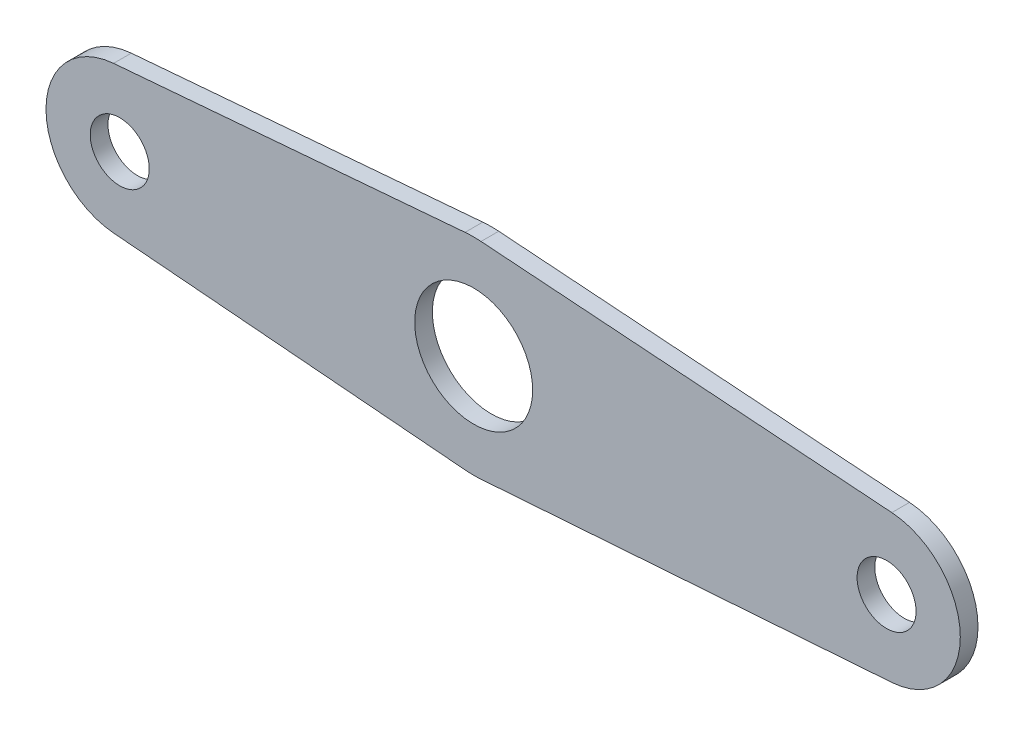
ISO-10303-21;
HEADER;
FILE_DESCRIPTION(('STEP AP214'),'2;1');
FILE_NAME('part.step','',(''),(''),'','','');
FILE_SCHEMA(('AUTOMOTIVE_DESIGN { 1 0 10303 214 1 1 1 1 }'));
ENDSEC;
DATA;
#1=APPLICATION_CONTEXT('core data for automotive mechanical design processes');
#2=APPLICATION_PROTOCOL_DEFINITION('international standard','automotive_design',2000,#1);
#3=PRODUCT_CONTEXT('',#1,'mechanical');
#4=PRODUCT('Part','Part','',(#3));
#5=PRODUCT_RELATED_PRODUCT_CATEGORY('part','',(#4));
#6=PRODUCT_DEFINITION_FORMATION('','',#4);
#7=PRODUCT_DEFINITION_CONTEXT('part definition',#1,'design');
#8=PRODUCT_DEFINITION('design','',#6,#7);
#9=PRODUCT_DEFINITION_SHAPE('','',#8);
#10=(LENGTH_UNIT() NAMED_UNIT(*) SI_UNIT(.MILLI.,.METRE.));
#11=(NAMED_UNIT(*) PLANE_ANGLE_UNIT() SI_UNIT($,.RADIAN.));
#12=(NAMED_UNIT(*) SI_UNIT($,.STERADIAN.) SOLID_ANGLE_UNIT());
#13=UNCERTAINTY_MEASURE_WITH_UNIT(LENGTH_MEASURE(1.E-05),#10,'distance_accuracy_value','');
#14=(GEOMETRIC_REPRESENTATION_CONTEXT(3) GLOBAL_UNCERTAINTY_ASSIGNED_CONTEXT((#13)) GLOBAL_UNIT_ASSIGNED_CONTEXT((#10,
#11,#12)) REPRESENTATION_CONTEXT('',''));
#15=CARTESIAN_POINT('',(0.,0.,0.));
#16=DIRECTION('',(0.,0.,1.));
#17=DIRECTION('',(1.,0.,0.));
#18=AXIS2_PLACEMENT_3D('',#15,#16,#17);
#19=CARTESIAN_POINT('',(-60.,0.,3.));
#20=DIRECTION('',(0.,0.,1.));
#21=DIRECTION('',(1.,0.,0.));
#22=AXIS2_PLACEMENT_3D('',#19,#20,#21);
#23=PLANE('',#22);
#24=CARTESIAN_POINT('',(0.,0.,3.));
#25=DIRECTION('',(0.,0.,1.));
#26=DIRECTION('',(1.,0.,0.));
#27=AXIS2_PLACEMENT_3D('',#24,#25,#26);
#28=CIRCLE('',#27,10.);
#29=CARTESIAN_POINT('',(10.,0.,3.));
#30=VERTEX_POINT('',#29);
#31=EDGE_CURVE('E213',#30,#30,#28,.T.);
#32=ORIENTED_EDGE('',*,*,#31,.F.);
#33=EDGE_LOOP('',(#32));
#34=FACE_BOUND('',#33,.T.);
#35=CARTESIAN_POINT('',(-60.,0.,3.));
#36=DIRECTION('',(0.,0.,1.));
#37=DIRECTION('',(1.,0.,0.));
#38=AXIS2_PLACEMENT_3D('',#35,#36,#37);
#39=CIRCLE('',#38,12.5);
#40=CARTESIAN_POINT('',(-61.0416666666667,12.4565216073973,3.));
#41=VERTEX_POINT('',#40);
#42=CARTESIAN_POINT('',(-61.0416666666667,-12.4565216073973,3.));
#43=VERTEX_POINT('',#42);
#44=EDGE_CURVE('E164',#41,#43,#39,.T.);
#45=ORIENTED_EDGE('',*,*,#44,.T.);
#46=DIRECTION('',(0.996521728591783,-0.0833333333333333,0.));
#47=VECTOR('',#46,1.);
#48=CARTESIAN_POINT('',(-61.0416666666667,-12.4565216073973,3.));
#49=LINE('',#48,#47);
#50=CARTESIAN_POINT('',(-1.45833333333334,-17.4391302503562,3.));
#51=VERTEX_POINT('',#50);
#52=EDGE_CURVE('E100',#43,#51,#49,.T.);
#53=ORIENTED_EDGE('',*,*,#52,.T.);
#54=CARTESIAN_POINT('',(0.,0.,3.));
#55=DIRECTION('',(0.,0.,1.));
#56=DIRECTION('',(1.,0.,0.));
#57=AXIS2_PLACEMENT_3D('',#54,#55,#56);
#58=CIRCLE('',#57,17.5);
#59=CARTESIAN_POINT('',(1.25,-17.4553000547112,3.));
#60=VERTEX_POINT('',#59);
#61=EDGE_CURVE('E185',#51,#60,#58,.T.);
#62=ORIENTED_EDGE('',*,*,#61,.T.);
#63=DIRECTION('',(0.997445717412067,0.0714285714285715,0.));
#64=VECTOR('',#63,1.);
#65=CARTESIAN_POINT('',(1.25,-17.4553000547112,3.));
#66=LINE('',#65,#64);
#67=CARTESIAN_POINT('',(70.8928571428572,-12.4680714676508,3.));
#68=VERTEX_POINT('',#67);
#69=EDGE_CURVE('E199',#60,#68,#66,.T.);
#70=ORIENTED_EDGE('',*,*,#69,.T.);
#71=CARTESIAN_POINT('',(70.,0.,3.));
#72=DIRECTION('',(0.,0.,1.));
#73=DIRECTION('',(1.,0.,0.));
#74=AXIS2_PLACEMENT_3D('',#71,#72,#73);
#75=CIRCLE('',#74,12.5);
#76=CARTESIAN_POINT('',(70.8928571428572,12.4680714676508,3.));
#77=VERTEX_POINT('',#76);
#78=EDGE_CURVE('E119',#68,#77,#75,.T.);
#79=ORIENTED_EDGE('',*,*,#78,.T.);
#80=DIRECTION('',(-0.997445717412067,0.0714285714285714,0.));
#81=VECTOR('',#80,1.);
#82=CARTESIAN_POINT('',(1.25,17.4553000547112,3.));
#83=LINE('',#82,#81);
#84=CARTESIAN_POINT('',(1.25,17.4553000547112,3.));
#85=VERTEX_POINT('',#84);
#86=EDGE_CURVE('E113',#77,#85,#83,.T.);
#87=ORIENTED_EDGE('',*,*,#86,.T.);
#88=CARTESIAN_POINT('',(0.,0.,3.));
#89=DIRECTION('',(0.,0.,1.));
#90=DIRECTION('',(1.,0.,0.));
#91=AXIS2_PLACEMENT_3D('',#88,#89,#90);
#92=CIRCLE('',#91,17.5);
#93=CARTESIAN_POINT('',(-1.45833333333333,17.4391302503562,3.));
#94=VERTEX_POINT('',#93);
#95=EDGE_CURVE('E117',#85,#94,#92,.T.);
#96=ORIENTED_EDGE('',*,*,#95,.T.);
#97=DIRECTION('',(-0.996521728591783,-0.0833333333333334,0.));
#98=VECTOR('',#97,1.);
#99=CARTESIAN_POINT('',(-61.0416666666667,12.4565216073973,3.));
#100=LINE('',#99,#98);
#101=EDGE_CURVE('E57',#94,#41,#100,.T.);
#102=ORIENTED_EDGE('',*,*,#101,.T.);
#103=EDGE_LOOP('',(#45,#53,#62,#70,#79,#87,#96,#102));
#104=FACE_BOUND('',#103,.T.);
#105=CARTESIAN_POINT('',(-60.,0.,3.));
#106=DIRECTION('',(0.,0.,1.));
#107=DIRECTION('',(1.,0.,0.));
#108=AXIS2_PLACEMENT_3D('',#105,#106,#107);
#109=CIRCLE('',#108,5.);
#110=CARTESIAN_POINT('',(-55.,0.,3.));
#111=VERTEX_POINT('',#110);
#112=EDGE_CURVE('E146',#111,#111,#109,.T.);
#113=ORIENTED_EDGE('',*,*,#112,.F.);
#114=EDGE_LOOP('',(#113));
#115=FACE_BOUND('',#114,.T.);
#116=CARTESIAN_POINT('',(70.,0.,3.));
#117=DIRECTION('',(0.,0.,1.));
#118=DIRECTION('',(1.,0.,0.));
#119=AXIS2_PLACEMENT_3D('',#116,#117,#118);
#120=CIRCLE('',#119,5.);
#121=CARTESIAN_POINT('',(75.,0.,3.));
#122=VERTEX_POINT('',#121);
#123=EDGE_CURVE('E221',#122,#122,#120,.T.);
#124=ORIENTED_EDGE('',*,*,#123,.F.);
#125=EDGE_LOOP('',(#124));
#126=FACE_BOUND('',#125,.T.);
#127=ADVANCED_FACE('F39',(#34,#104,#115,#126),#23,.T.);
#128=CARTESIAN_POINT('',(-60.,0.,0.));
#129=DIRECTION('',(0.,0.,1.));
#130=DIRECTION('',(1.,0.,0.));
#131=AXIS2_PLACEMENT_3D('',#128,#129,#130);
#132=PLANE('',#131);
#133=CARTESIAN_POINT('',(-60.,0.,0.));
#134=DIRECTION('',(0.,0.,1.));
#135=DIRECTION('',(1.,0.,0.));
#136=AXIS2_PLACEMENT_3D('',#133,#134,#135);
#137=CIRCLE('',#136,12.5);
#138=CARTESIAN_POINT('',(-61.0416666666667,12.4565216073973,0.));
#139=VERTEX_POINT('',#138);
#140=CARTESIAN_POINT('',(-61.0416666666667,-12.4565216073973,0.));
#141=VERTEX_POINT('',#140);
#142=EDGE_CURVE('E141',#139,#141,#137,.T.);
#143=ORIENTED_EDGE('',*,*,#142,.F.);
#144=DIRECTION('',(-0.996521728591783,-0.0833333333333334,0.));
#145=VECTOR('',#144,1.);
#146=CARTESIAN_POINT('',(-61.0416666666667,12.4565216073973,0.));
#147=LINE('',#146,#145);
#148=CARTESIAN_POINT('',(-1.45833333333333,17.4391302503562,0.));
#149=VERTEX_POINT('',#148);
#150=EDGE_CURVE('E92',#149,#139,#147,.T.);
#151=ORIENTED_EDGE('',*,*,#150,.F.);
#152=CARTESIAN_POINT('',(0.,0.,0.));
#153=DIRECTION('',(0.,0.,1.));
#154=DIRECTION('',(1.,0.,0.));
#155=AXIS2_PLACEMENT_3D('',#152,#153,#154);
#156=CIRCLE('',#155,17.5);
#157=CARTESIAN_POINT('',(1.25,17.4553000547112,0.));
#158=VERTEX_POINT('',#157);
#159=EDGE_CURVE('E86',#158,#149,#156,.T.);
#160=ORIENTED_EDGE('',*,*,#159,.F.);
#161=DIRECTION('',(-0.997445717412067,0.0714285714285714,0.));
#162=VECTOR('',#161,1.);
#163=CARTESIAN_POINT('',(1.25,17.4553000547112,0.));
#164=LINE('',#163,#162);
#165=CARTESIAN_POINT('',(70.8928571428572,12.4680714676508,0.));
#166=VERTEX_POINT('',#165);
#167=EDGE_CURVE('E128',#166,#158,#164,.T.);
#168=ORIENTED_EDGE('',*,*,#167,.F.);
#169=CARTESIAN_POINT('',(70.,0.,0.));
#170=DIRECTION('',(0.,0.,1.));
#171=DIRECTION('',(1.,0.,0.));
#172=AXIS2_PLACEMENT_3D('',#169,#170,#171);
#173=CIRCLE('',#172,12.5);
#174=CARTESIAN_POINT('',(70.8928571428572,-12.4680714676508,0.));
#175=VERTEX_POINT('',#174);
#176=EDGE_CURVE('E155',#175,#166,#173,.T.);
#177=ORIENTED_EDGE('',*,*,#176,.F.);
#178=DIRECTION('',(0.997445717412067,0.0714285714285715,0.));
#179=VECTOR('',#178,1.);
#180=CARTESIAN_POINT('',(1.25,-17.4553000547112,0.));
#181=LINE('',#180,#179);
#182=CARTESIAN_POINT('',(1.25,-17.4553000547112,0.));
#183=VERTEX_POINT('',#182);
#184=EDGE_CURVE('E152',#183,#175,#181,.T.);
#185=ORIENTED_EDGE('',*,*,#184,.F.);
#186=CARTESIAN_POINT('',(0.,0.,0.));
#187=DIRECTION('',(0.,0.,1.));
#188=DIRECTION('',(1.,0.,0.));
#189=AXIS2_PLACEMENT_3D('',#186,#187,#188);
#190=CIRCLE('',#189,17.5);
#191=CARTESIAN_POINT('',(-1.45833333333334,-17.4391302503562,0.));
#192=VERTEX_POINT('',#191);
#193=EDGE_CURVE('E149',#192,#183,#190,.T.);
#194=ORIENTED_EDGE('',*,*,#193,.F.);
#195=DIRECTION('',(0.996521728591783,-0.0833333333333333,0.));
#196=VECTOR('',#195,1.);
#197=CARTESIAN_POINT('',(-61.0416666666667,-12.4565216073973,0.));
#198=LINE('',#197,#196);
#199=EDGE_CURVE('E145',#141,#192,#198,.T.);
#200=ORIENTED_EDGE('',*,*,#199,.F.);
#201=EDGE_LOOP('',(#143,#151,#160,#168,#177,#185,#194,#200));
#202=FACE_BOUND('',#201,.T.);
#203=CARTESIAN_POINT('',(-60.,0.,0.));
#204=DIRECTION('',(0.,0.,1.));
#205=DIRECTION('',(1.,0.,0.));
#206=AXIS2_PLACEMENT_3D('',#203,#204,#205);
#207=CIRCLE('',#206,5.);
#208=CARTESIAN_POINT('',(-55.,0.,0.));
#209=VERTEX_POINT('',#208);
#210=EDGE_CURVE('E209',#209,#209,#207,.T.);
#211=ORIENTED_EDGE('',*,*,#210,.T.);
#212=EDGE_LOOP('',(#211));
#213=FACE_BOUND('',#212,.T.);
#214=CARTESIAN_POINT('',(0.,0.,0.));
#215=DIRECTION('',(0.,0.,1.));
#216=DIRECTION('',(1.,0.,0.));
#217=AXIS2_PLACEMENT_3D('',#214,#215,#216);
#218=CIRCLE('',#217,10.);
#219=CARTESIAN_POINT('',(10.,0.,0.));
#220=VERTEX_POINT('',#219);
#221=EDGE_CURVE('E217',#220,#220,#218,.T.);
#222=ORIENTED_EDGE('',*,*,#221,.T.);
#223=EDGE_LOOP('',(#222));
#224=FACE_BOUND('',#223,.T.);
#225=CARTESIAN_POINT('',(70.,0.,0.));
#226=DIRECTION('',(0.,0.,1.));
#227=DIRECTION('',(1.,0.,0.));
#228=AXIS2_PLACEMENT_3D('',#225,#226,#227);
#229=CIRCLE('',#228,5.);
#230=CARTESIAN_POINT('',(75.,0.,0.));
#231=VERTEX_POINT('',#230);
#232=EDGE_CURVE('E225',#231,#231,#229,.T.);
#233=ORIENTED_EDGE('',*,*,#232,.T.);
#234=EDGE_LOOP('',(#233));
#235=FACE_BOUND('',#234,.T.);
#236=ADVANCED_FACE('F189',(#202,#213,#224,#235),#132,.F.);
#237=CARTESIAN_POINT('',(-60.,0.,3.));
#238=DIRECTION('',(0.,0.,-1.));
#239=DIRECTION('',(-1.,0.,0.));
#240=AXIS2_PLACEMENT_3D('',#237,#238,#239);
#241=CYLINDRICAL_SURFACE('',#240,12.5);
#242=ORIENTED_EDGE('',*,*,#142,.T.);
#243=DIRECTION('',(0.,0.,-1.));
#244=VECTOR('',#243,1.);
#245=CARTESIAN_POINT('',(-61.0416666666667,-12.4565216073973,3.));
#246=LINE('',#245,#244);
#247=EDGE_CURVE('E11',#43,#141,#246,.T.);
#248=ORIENTED_EDGE('',*,*,#247,.F.);
#249=ORIENTED_EDGE('',*,*,#44,.F.);
#250=DIRECTION('',(0.,0.,-1.));
#251=VECTOR('',#250,1.);
#252=CARTESIAN_POINT('',(-61.0416666666667,12.4565216073973,3.));
#253=LINE('',#252,#251);
#254=EDGE_CURVE('E137',#41,#139,#253,.T.);
#255=ORIENTED_EDGE('',*,*,#254,.T.);
#256=EDGE_LOOP('',(#242,#248,#249,#255));
#257=FACE_BOUND('',#256,.T.);
#258=ADVANCED_FACE('F41',(#257),#241,.T.);
#259=CARTESIAN_POINT('',(-61.0416666666667,-12.4565216073973,3.));
#260=DIRECTION('',(0.0833333333333333,0.996521728591783,0.));
#261=DIRECTION('',(-0.996521728591783,0.0833333333333333,0.));
#262=AXIS2_PLACEMENT_3D('',#259,#260,#261);
#263=PLANE('',#262);
#264=ORIENTED_EDGE('',*,*,#199,.T.);
#265=DIRECTION('',(0.,0.,-1.));
#266=VECTOR('',#265,1.);
#267=CARTESIAN_POINT('',(-1.45833333333334,-17.4391302503562,3.));
#268=LINE('',#267,#266);
#269=EDGE_CURVE('E49',#51,#192,#268,.T.);
#270=ORIENTED_EDGE('',*,*,#269,.F.);
#271=ORIENTED_EDGE('',*,*,#52,.F.);
#272=ORIENTED_EDGE('',*,*,#247,.T.);
#273=EDGE_LOOP('',(#264,#270,#271,#272));
#274=FACE_BOUND('',#273,.T.);
#275=ADVANCED_FACE('F260',(#274),#263,.F.);
#276=CARTESIAN_POINT('',(0.,0.,3.));
#277=DIRECTION('',(0.,0.,-1.));
#278=DIRECTION('',(-1.,0.,0.));
#279=AXIS2_PLACEMENT_3D('',#276,#277,#278);
#280=CYLINDRICAL_SURFACE('',#279,17.5);
#281=ORIENTED_EDGE('',*,*,#193,.T.);
#282=DIRECTION('',(0.,0.,-1.));
#283=VECTOR('',#282,1.);
#284=CARTESIAN_POINT('',(1.25,-17.4553000547112,3.));
#285=LINE('',#284,#283);
#286=EDGE_CURVE('E175',#60,#183,#285,.T.);
#287=ORIENTED_EDGE('',*,*,#286,.F.);
#288=ORIENTED_EDGE('',*,*,#61,.F.);
#289=ORIENTED_EDGE('',*,*,#269,.T.);
#290=EDGE_LOOP('',(#281,#287,#288,#289));
#291=FACE_BOUND('',#290,.T.);
#292=ADVANCED_FACE('F183',(#291),#280,.T.);
#293=CARTESIAN_POINT('',(1.25,-17.4553000547112,3.));
#294=DIRECTION('',(-0.0714285714285715,0.997445717412067,0.));
#295=DIRECTION('',(-0.997445717412067,-0.0714285714285715,0.));
#296=AXIS2_PLACEMENT_3D('',#293,#294,#295);
#297=PLANE('',#296);
#298=ORIENTED_EDGE('',*,*,#184,.T.);
#299=DIRECTION('',(0.,0.,-1.));
#300=VECTOR('',#299,1.);
#301=CARTESIAN_POINT('',(70.8928571428572,-12.4680714676508,3.));
#302=LINE('',#301,#300);
#303=EDGE_CURVE('E171',#68,#175,#302,.T.);
#304=ORIENTED_EDGE('',*,*,#303,.F.);
#305=ORIENTED_EDGE('',*,*,#69,.F.);
#306=ORIENTED_EDGE('',*,*,#286,.T.);
#307=EDGE_LOOP('',(#298,#304,#305,#306));
#308=FACE_BOUND('',#307,.T.);
#309=ADVANCED_FACE('F194',(#308),#297,.F.);
#310=CARTESIAN_POINT('',(70.,0.,3.));
#311=DIRECTION('',(0.,0.,-1.));
#312=DIRECTION('',(-1.,0.,0.));
#313=AXIS2_PLACEMENT_3D('',#310,#311,#312);
#314=CYLINDRICAL_SURFACE('',#313,12.5);
#315=ORIENTED_EDGE('',*,*,#176,.T.);
#316=DIRECTION('',(0.,0.,-1.));
#317=VECTOR('',#316,1.);
#318=CARTESIAN_POINT('',(70.8928571428572,12.4680714676508,3.));
#319=LINE('',#318,#317);
#320=EDGE_CURVE('E130',#77,#166,#319,.T.);
#321=ORIENTED_EDGE('',*,*,#320,.F.);
#322=ORIENTED_EDGE('',*,*,#78,.F.);
#323=ORIENTED_EDGE('',*,*,#303,.T.);
#324=EDGE_LOOP('',(#315,#321,#322,#323));
#325=FACE_BOUND('',#324,.T.);
#326=ADVANCED_FACE('F197',(#325),#314,.T.);
#327=CARTESIAN_POINT('',(1.25,17.4553000547112,3.));
#328=DIRECTION('',(-0.0714285714285714,-0.997445717412067,0.));
#329=DIRECTION('',(0.997445717412067,-0.0714285714285714,0.));
#330=AXIS2_PLACEMENT_3D('',#327,#328,#329);
#331=PLANE('',#330);
#332=ORIENTED_EDGE('',*,*,#167,.T.);
#333=DIRECTION('',(0.,0.,-1.));
#334=VECTOR('',#333,1.);
#335=CARTESIAN_POINT('',(1.25,17.4553000547112,3.));
#336=LINE('',#335,#334);
#337=EDGE_CURVE('E125',#85,#158,#336,.T.);
#338=ORIENTED_EDGE('',*,*,#337,.F.);
#339=ORIENTED_EDGE('',*,*,#86,.F.);
#340=ORIENTED_EDGE('',*,*,#320,.T.);
#341=EDGE_LOOP('',(#332,#338,#339,#340));
#342=FACE_BOUND('',#341,.T.);
#343=ADVANCED_FACE('F126',(#342),#331,.F.);
#344=CARTESIAN_POINT('',(0.,0.,3.));
#345=DIRECTION('',(0.,0.,-1.));
#346=DIRECTION('',(-1.,0.,0.));
#347=AXIS2_PLACEMENT_3D('',#344,#345,#346);
#348=CYLINDRICAL_SURFACE('',#347,17.5);
#349=ORIENTED_EDGE('',*,*,#159,.T.);
#350=DIRECTION('',(0.,0.,-1.));
#351=VECTOR('',#350,1.);
#352=CARTESIAN_POINT('',(-1.45833333333333,17.4391302503562,3.));
#353=LINE('',#352,#351);
#354=EDGE_CURVE('E131',#94,#149,#353,.T.);
#355=ORIENTED_EDGE('',*,*,#354,.F.);
#356=ORIENTED_EDGE('',*,*,#95,.F.);
#357=ORIENTED_EDGE('',*,*,#337,.T.);
#358=EDGE_LOOP('',(#349,#355,#356,#357));
#359=FACE_BOUND('',#358,.T.);
#360=ADVANCED_FACE('F133',(#359),#348,.T.);
#361=CARTESIAN_POINT('',(-61.0416666666667,12.4565216073973,3.));
#362=DIRECTION('',(0.0833333333333334,-0.996521728591783,0.));
#363=DIRECTION('',(0.996521728591783,0.0833333333333334,0.));
#364=AXIS2_PLACEMENT_3D('',#361,#362,#363);
#365=PLANE('',#364);
#366=ORIENTED_EDGE('',*,*,#150,.T.);
#367=ORIENTED_EDGE('',*,*,#254,.F.);
#368=ORIENTED_EDGE('',*,*,#101,.F.);
#369=ORIENTED_EDGE('',*,*,#354,.T.);
#370=EDGE_LOOP('',(#366,#367,#368,#369));
#371=FACE_BOUND('',#370,.T.);
#372=ADVANCED_FACE('F248',(#371),#365,.F.);
#373=CARTESIAN_POINT('',(-60.,0.,3.));
#374=DIRECTION('',(0.,0.,-1.));
#375=DIRECTION('',(-1.,0.,0.));
#376=AXIS2_PLACEMENT_3D('',#373,#374,#375);
#377=CYLINDRICAL_SURFACE('',#376,5.);
#378=ORIENTED_EDGE('',*,*,#112,.T.);
#379=EDGE_LOOP('',(#378));
#380=FACE_BOUND('',#379,.T.);
#381=ORIENTED_EDGE('',*,*,#210,.F.);
#382=EDGE_LOOP('',(#381));
#383=FACE_BOUND('',#382,.T.);
#384=ADVANCED_FACE('F245',(#380,#383),#377,.F.);
#385=CARTESIAN_POINT('',(0.,0.,3.));
#386=DIRECTION('',(0.,0.,-1.));
#387=DIRECTION('',(-1.,0.,0.));
#388=AXIS2_PLACEMENT_3D('',#385,#386,#387);
#389=CYLINDRICAL_SURFACE('',#388,10.);
#390=ORIENTED_EDGE('',*,*,#31,.T.);
#391=EDGE_LOOP('',(#390));
#392=FACE_BOUND('',#391,.T.);
#393=ORIENTED_EDGE('',*,*,#221,.F.);
#394=EDGE_LOOP('',(#393));
#395=FACE_BOUND('',#394,.T.);
#396=ADVANCED_FACE('F324',(#392,#395),#389,.F.);
#397=CARTESIAN_POINT('',(70.,0.,3.));
#398=DIRECTION('',(0.,0.,-1.));
#399=DIRECTION('',(-1.,0.,0.));
#400=AXIS2_PLACEMENT_3D('',#397,#398,#399);
#401=CYLINDRICAL_SURFACE('',#400,5.);
#402=ORIENTED_EDGE('',*,*,#123,.T.);
#403=EDGE_LOOP('',(#402));
#404=FACE_BOUND('',#403,.T.);
#405=ORIENTED_EDGE('',*,*,#232,.F.);
#406=EDGE_LOOP('',(#405));
#407=FACE_BOUND('',#406,.T.);
#408=ADVANCED_FACE('F233',(#404,#407),#401,.F.);
#409=CLOSED_SHELL('',(#127,#236,#258,#275,#292,#309,#326,#343,#360,#372,#384,#396,#408));
#410=MANIFOLD_SOLID_BREP('B2',#409);
#411=ADVANCED_BREP_SHAPE_REPRESENTATION('',(#18,#410),#14);
#412=SHAPE_DEFINITION_REPRESENTATION(#9,#411);
ENDSEC;
END-ISO-10303-21;
